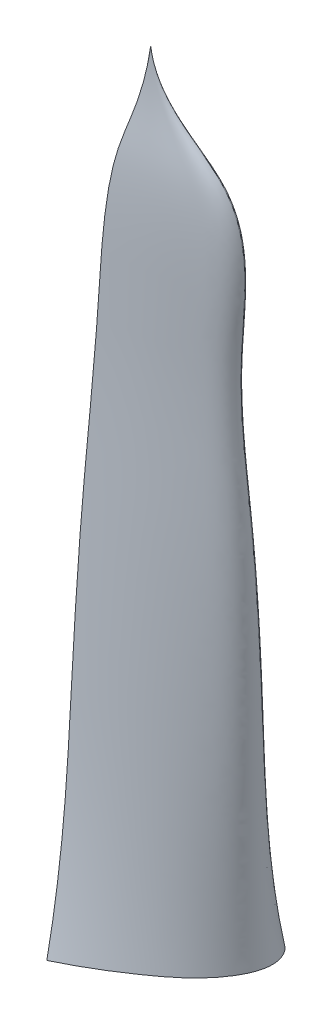
ISO-10303-21;
HEADER;
FILE_DESCRIPTION(('STEP AP214'),'2;1');
FILE_NAME('part.step','',(''),(''),'','','');
FILE_SCHEMA(('AUTOMOTIVE_DESIGN { 1 0 10303 214 1 1 1 1 }'));
ENDSEC;
DATA;
#1=APPLICATION_CONTEXT('core data for automotive mechanical design processes');
#2=APPLICATION_PROTOCOL_DEFINITION('international standard','automotive_design',2000,#1);
#3=PRODUCT_CONTEXT('',#1,'mechanical');
#4=PRODUCT('Part','Part','',(#3));
#5=PRODUCT_RELATED_PRODUCT_CATEGORY('part','',(#4));
#6=PRODUCT_DEFINITION_FORMATION('','',#4);
#7=PRODUCT_DEFINITION_CONTEXT('part definition',#1,'design');
#8=PRODUCT_DEFINITION('design','',#6,#7);
#9=PRODUCT_DEFINITION_SHAPE('','',#8);
#10=(LENGTH_UNIT() NAMED_UNIT(*) SI_UNIT(.MILLI.,.METRE.));
#11=(NAMED_UNIT(*) PLANE_ANGLE_UNIT() SI_UNIT($,.RADIAN.));
#12=(NAMED_UNIT(*) SI_UNIT($,.STERADIAN.) SOLID_ANGLE_UNIT());
#13=UNCERTAINTY_MEASURE_WITH_UNIT(LENGTH_MEASURE(1.E-05),#10,'distance_accuracy_value','');
#14=(GEOMETRIC_REPRESENTATION_CONTEXT(3) GLOBAL_UNCERTAINTY_ASSIGNED_CONTEXT((#13)) GLOBAL_UNIT_ASSIGNED_CONTEXT((#10,
#11,#12)) REPRESENTATION_CONTEXT('',''));
#15=CARTESIAN_POINT('',(0.,0.,0.));
#16=DIRECTION('',(0.,0.,1.));
#17=DIRECTION('',(1.,0.,0.));
#18=AXIS2_PLACEMENT_3D('',#15,#16,#17);
#19=CARTESIAN_POINT('',(27.3903864156705,193.04,16.7732601391821));
#20=DIRECTION('',(0.,1.,0.));
#21=DIRECTION('',(0.,0.,1.));
#22=AXIS2_PLACEMENT_3D('',#19,#20,#21);
#23=PLANE('',#22);
#24=CARTESIAN_POINT('',(-51.0502633096916,193.04,65.8880250046538));
#25=CARTESIAN_POINT('',(-29.4080359716208,193.04,55.5335888101065));
#26=CARTESIAN_POINT('',(6.39775669908416,193.04,34.1414433918272));
#27=CARTESIAN_POINT('',(49.3106608585686,193.04,-0.0869634288471449));
#28=CARTESIAN_POINT('',(69.4256113628962,193.04,-38.7953768272498));
#29=CARTESIAN_POINT('',(61.1191599391449,193.04,-58.2204172722321));
#30=CARTESIAN_POINT('',(56.582333939445,193.04,-63.1890217779224));
#31=B_SPLINE_CURVE_WITH_KNOTS('',3,(#24,#25,#26,#27,#28,#29,#30),.UNSPECIFIED.,.F.,.F.,(4,1,1,1,
4),(0.0177171020432467,0.399201612433671,0.669902249986319,0.904095271302126,1.),.UNSPECIFIED.);
#32=CARTESIAN_POINT('',(-51.0502633096916,193.04,65.8880250046538));
#33=VERTEX_POINT('',#32);
#34=CARTESIAN_POINT('',(56.5823339394449,193.04,-63.1890217779224));
#35=VERTEX_POINT('',#34);
#36=EDGE_CURVE('E204',#33,#35,#31,.T.);
#37=ORIENTED_EDGE('',*,*,#36,.F.);
#38=DIRECTION('',(-0.62278778048811,0.,0.78239081057659));
#39=VECTOR('',#38,1.);
#40=CARTESIAN_POINT('',(-51.0502633096916,193.04,65.8880250046538));
#41=LINE('',#40,#39);
#42=CARTESIAN_POINT('',(51.5604673550769,193.04,-63.0189562398136));
#43=VERTEX_POINT('',#42);
#44=EDGE_CURVE('E190',#43,#33,#41,.T.);
#45=ORIENTED_EDGE('',*,*,#44,.F.);
#46=CARTESIAN_POINT('',(54.1439218116008,193.04,-60.9625109886419));
#47=DIRECTION('',(0.,1.,0.));
#48=DIRECTION('',(0.,0.,-1.));
#49=AXIS2_PLACEMENT_3D('',#46,#47,#48);
#50=CIRCLE('',#49,3.30199999999999);
#51=EDGE_CURVE('E191',#35,#43,#50,.T.);
#52=ORIENTED_EDGE('',*,*,#51,.F.);
#53=EDGE_LOOP('',(#37,#45,#52));
#54=FACE_BOUND('',#53,.T.);
#55=ADVANCED_FACE('F162',(#54),#23,.F.);
#56=CARTESIAN_POINT('',(56.5823339394449,193.04,-63.1890217779224));
#57=CARTESIAN_POINT('',(57.6564598597152,224.95538014561,-54.9881752056704));
#58=CARTESIAN_POINT('',(60.1807349888683,305.115980336233,-40.0172295989538));
#59=CARTESIAN_POINT('',(66.0053734685914,433.937675680103,-31.1541565366904));
#60=CARTESIAN_POINT('',(65.8905401425748,580.253237547307,-22.2820204894803));
#61=CARTESIAN_POINT('',(51.8750555986007,719.661239150954,-15.3549033811939));
#62=CARTESIAN_POINT('',(82.3922586658384,870.668992981242,-14.5492681769807));
#63=CARTESIAN_POINT('',(-8.88055085515012,916.999693508035,-1.90958778796577));
#64=CARTESIAN_POINT('',(-13.7823194,965.2,0.));
#65=CARTESIAN_POINT('',(56.4638482663645,193.04,-63.3187839616972));
#66=CARTESIAN_POINT('',(57.5611742421126,224.955548362745,-55.1229280616902));
#67=CARTESIAN_POINT('',(60.1279877256092,305.115862407605,-40.1580139305224));
#68=CARTESIAN_POINT('',(65.9944598121193,433.937712998386,-31.3011336589291));
#69=CARTESIAN_POINT('',(65.9106477657984,580.253224905395,-22.4179870198765));
#70=CARTESIAN_POINT('',(51.9071782218437,719.661252454668,-15.4603857200904));
#71=CARTESIAN_POINT('',(82.4554967197115,870.668957051674,-14.6690591047114));
#72=CARTESIAN_POINT('',(-8.88005917627443,916.999749128808,-1.9207557726907));
#73=CARTESIAN_POINT('',(-13.7823194,965.2,0.));
#74=CARTESIAN_POINT('',(56.1891672771625,193.04,-63.5787000517568));
#75=CARTESIAN_POINT('',(57.3328933638662,224.955884797015,-55.3928254962396));
#76=CARTESIAN_POINT('',(59.9927303123508,305.115626550348,-40.4456095238959));
#77=CARTESIAN_POINT('',(65.9351402689739,433.937787634951,-31.5921801311704));
#78=CARTESIAN_POINT('',(65.9128826889724,580.253199621573,-22.6859669041055));
#79=CARTESIAN_POINT('',(51.9281669789958,719.661279062092,-15.6524172274836));
#80=CARTESIAN_POINT('',(82.5159249999944,870.668885192543,-14.8899596362624));
#81=CARTESIAN_POINT('',(-8.87907581852305,916.999860370353,-1.94309174214052));
#82=CARTESIAN_POINT('',(-13.7823194,965.2,0.));
#83=CARTESIAN_POINT('',(55.6306539667948,193.04,-63.9397414922138));
#84=CARTESIAN_POINT('',(56.8582727922136,224.95673087074,-55.7770098175588));
#85=CARTESIAN_POINT('',(59.6749244857976,305.115034838438,-40.861328721393));
#86=CARTESIAN_POINT('',(65.7483360880859,433.937967710507,-31.9918634622748));
#87=CARTESIAN_POINT('',(65.8116011526854,580.253163932211,-23.0570495595296));
#88=CARTESIAN_POINT('',(51.8872010906486,719.661241951824,-15.8984327595833));
#89=CARTESIAN_POINT('',(82.5103887607781,870.669050435,-15.1910231423962));
#90=CARTESIAN_POINT('',(-8.88668274564937,916.999596221878,-1.96646267979184));
#91=CARTESIAN_POINT('',(-13.7823194,965.2,0.));
#92=CARTESIAN_POINT('',(54.9005083188148,193.04,-64.2126402634231));
#93=CARTESIAN_POINT('',(56.2321380616942,224.95799215701,-56.0836334063638));
#94=CARTESIAN_POINT('',(59.2431489455097,305.114152598654,-41.2184873118182));
#95=CARTESIAN_POINT('',(65.4674632456956,433.938236926852,-32.3286989969087));
#96=CARTESIAN_POINT('',(65.6274529497712,580.253107916505,-23.3799002461271));
#97=CARTESIAN_POINT('',(51.7921266959312,719.661197114745,-16.1082493148372));
#98=CARTESIAN_POINT('',(82.4290903735151,870.669261899581,-15.4573838722488));
#99=CARTESIAN_POINT('',(-8.89742167562409,916.999257265133,-1.98580908746115));
#100=CARTESIAN_POINT('',(-13.7823194,965.2,0.));
#101=CARTESIAN_POINT('',(54.0308081842834,193.04,-64.3026441607041));
#102=CARTESIAN_POINT('',(55.484502610083,224.96063731182,-56.2345715733744));
#103=CARTESIAN_POINT('',(58.7206349931368,305.11230152654,-41.4688955227533));
#104=CARTESIAN_POINT('',(65.115883989263,433.938806056595,-32.5874970636968));
#105=CARTESIAN_POINT('',(65.3717150725977,580.252973854347,-23.6421289823099));
#106=CARTESIAN_POINT('',(51.6545643382135,719.661164936231,-16.2827020771166));
#107=CARTESIAN_POINT('',(82.2880819853897,870.669499672029,-15.6870701259289));
#108=CARTESIAN_POINT('',(-8.91140554867155,916.998869818139,-2.00113465174902));
#109=CARTESIAN_POINT('',(-13.7823194,965.2,0.));
#110=CARTESIAN_POINT('',(53.1691895578024,193.04,-64.1540091445387));
#111=CARTESIAN_POINT('',(54.7239882815451,224.96553040627,-56.1814923445432));
#112=CARTESIAN_POINT('',(58.1504890445573,305.108876468851,-41.5791697372709));
#113=CARTESIAN_POINT('',(64.7103436992304,433.939863567445,-32.7482380429167));
#114=CARTESIAN_POINT('',(65.0590618963279,580.252708603393,-23.8334923256712));
#115=CARTESIAN_POINT('',(51.4791497745836,719.661169769427,-16.4188618902051));
#116=CARTESIAN_POINT('',(82.0934690295777,870.669725472393,-15.8733795865566));
#117=CARTESIAN_POINT('',(-8.92820392892339,916.998489611829,-2.01324720602713));
#118=CARTESIAN_POINT('',(-13.7823194,965.2,0.));
#119=CARTESIAN_POINT('',(52.4591789731738,193.04,-63.8323394749903));
#120=CARTESIAN_POINT('',(54.0627907814066,224.9712052267,-55.9599075586258));
#121=CARTESIAN_POINT('',(57.5901012323702,305.104904073104,-41.5378876739306));
#122=CARTESIAN_POINT('',(64.2760187982233,433.941090813005,-32.8088286031577));
#123=CARTESIAN_POINT('',(64.7032981841885,580.252398100499,-23.9406314284259));
#124=CARTESIAN_POINT('',(51.2684384689246,719.661186096545,-16.5121183082841));
#125=CARTESIAN_POINT('',(81.850634764106,870.66995168895,-16.0093672875624));
#126=CARTESIAN_POINT('',(-8.94852215126564,916.998104723707,-2.02135777616444));
#127=CARTESIAN_POINT('',(-13.7823194,965.2,0.));
#128=CARTESIAN_POINT('',(51.9263705731792,193.04,-63.4343404191118));
#129=CARTESIAN_POINT('',(53.5406555717489,224.976066107133,-55.6434619568625));
#130=CARTESIAN_POINT('',(57.0953939482828,305.10150160146,-41.3713589594171));
#131=CARTESIAN_POINT('',(63.838352965756,433.94214116447,-32.7549937835935));
#132=CARTESIAN_POINT('',(64.3188343303388,580.252135317487,-23.9551664014298));
#133=CARTESIAN_POINT('',(51.0222949968938,719.66118820684,-16.5501071063237));
#134=CARTESIAN_POINT('',(81.5583523512899,870.670184952601,-16.0791679077899));
#135=CARTESIAN_POINT('',(-8.97249640887019,916.997712949794,-2.02545816039879));
#136=CARTESIAN_POINT('',(-13.7823194,965.2,0.));
#137=CARTESIAN_POINT('',(51.6699028453118,193.04,-63.1564369749746));
#138=CARTESIAN_POINT('',(53.2791463327736,224.978295036058,-55.4024997381768));
#139=CARTESIAN_POINT('',(56.8278613337418,305.099942068497,-41.2085452290257));
#140=CARTESIAN_POINT('',(63.5621418166873,433.94261932269,-32.6474946600604));
#141=CARTESIAN_POINT('',(64.0590067584314,580.252027534888,-23.8917552425177));
#142=CARTESIAN_POINT('',(50.831230572998,719.661141758879,-16.5251316684913));
#143=CARTESIAN_POINT('',(81.3290291852116,870.670449606891,-16.069477064001));
#144=CARTESIAN_POINT('',(-8.99295754271348,916.997285384362,-2.0199725892584));
#145=CARTESIAN_POINT('',(-13.7823194,965.2,0.));
#146=CARTESIAN_POINT('',(42.9320954690671,193.04,-52.1793747879095));
#147=CARTESIAN_POINT('',(44.3391284703665,225.066863264398,-45.897507455777));
#148=CARTESIAN_POINT('',(47.3300395583481,305.037973039536,-34.0217617863481));
#149=CARTESIAN_POINT('',(53.3296959831195,433.961618090045,-27.0724261209034));
#150=CARTESIAN_POINT('',(53.9096080326386,580.247749182188,-19.7899384487152));
#151=CARTESIAN_POINT('',(42.5418127447663,719.659279433144,-13.7396221624817));
#152=CARTESIAN_POINT('',(70.9162320736962,870.681021323991,-13.2556191513442));
#153=CARTESIAN_POINT('',(-9.81059058133363,916.980208526185,-1.79831394180666));
#154=CARTESIAN_POINT('',(-13.7823194,965.2,0.));
#155=CARTESIAN_POINT('',(25.7931119453523,193.04,-30.6481507791976));
#156=CARTESIAN_POINT('',(26.6540509985509,225.177085265039,-26.8524291397478));
#157=CARTESIAN_POINT('',(28.7334041992243,304.960889218507,-20.1395100158756));
#158=CARTESIAN_POINT('',(33.0891250906794,433.985070596844,-15.9700069835312));
#159=CARTESIAN_POINT('',(33.8486393262921,580.243124581767,-11.7191965984292));
#160=CARTESIAN_POINT('',(26.0715876144003,719.654352345821,-8.12721519566173));
#161=CARTESIAN_POINT('',(50.3244190612465,870.702856059784,-7.93520187335008));
#162=CARTESIAN_POINT('',(-11.5468189752715,916.945312711716,-0.945933998451135));
#163=CARTESIAN_POINT('',(-13.7823194,965.2,0.));
#164=CARTESIAN_POINT('',(0.25510202269265,193.04,1.43453438242004));
#165=CARTESIAN_POINT('',(0.372830159534729,225.234181986523,1.21141081497311));
#166=CARTESIAN_POINT('',(0.872015869825522,304.920940193471,0.862786304143008));
#167=CARTESIAN_POINT('',(2.74818768396476,433.997317567791,0.608726424922191));
#168=CARTESIAN_POINT('',(3.70222561660654,580.240369574175,0.443525964014228));
#169=CARTESIAN_POINT('',(1.26872589166292,719.653140245102,0.264338842013009));
#170=CARTESIAN_POINT('',(19.2288338901228,870.709709597679,0.293360088173849));
#171=CARTESIAN_POINT('',(-14.0783497515129,916.934243610955,0.0127774771608116));
#172=CARTESIAN_POINT('',(-13.7823194,965.2,0.));
#173=CARTESIAN_POINT('',(-25.2829078999671,193.04,33.5172195440378));
#174=CARTESIAN_POINT('',(-25.9406201125143,225.17075109164,29.3666451358804));
#175=CARTESIAN_POINT('',(-26.9667388481337,304.965308380201,21.8008570419822));
#176=CARTESIAN_POINT('',(-27.6001087395354,433.983779665615,17.2085549137118));
#177=CARTESIAN_POINT('',(-26.441000940373,580.243182393655,12.5963805665918));
#178=CARTESIAN_POINT('',(-23.5395376355273,719.655410965347,8.67430621416367));
#179=CARTESIAN_POINT('',(-11.8503793823063,870.699022245278,8.46520166904806));
#180=CARTESIAN_POINT('',(-16.6354539098846,916.951372758912,1.06019224077672));
#181=CARTESIAN_POINT('',(-13.7823194,965.2,0.));
#182=CARTESIAN_POINT('',(-42.4218914236818,193.04,55.0484435527497));
#183=CARTESIAN_POINT('',(-43.5649709896749,225.024372175514,48.2342641612558));
#184=CARTESIAN_POINT('',(-45.6060334538895,305.067700720619,35.8078300370235));
#185=CARTESIAN_POINT('',(-47.8267440443157,433.952515590133,28.2699327633613));
#186=CARTESIAN_POINT('',(-46.5082301331314,580.249756871225,20.6865802004631));
#187=CARTESIAN_POINT('',(-39.9986328014514,719.660340233156,14.249851618118));
#188=CARTESIAN_POINT('',(-32.4762060622446,870.675392957001,13.8994392006098));
#189=CARTESIAN_POINT('',(-18.3185198573651,916.98927619947,1.73454152372721));
#190=CARTESIAN_POINT('',(-13.7823194,965.2,0.));
#191=CARTESIAN_POINT('',(-51.0502633096916,193.04,65.8880250046538));
#192=CARTESIAN_POINT('',(-52.4360265524076,224.951182717451,57.7420431214916));
#193=CARTESIAN_POINT('',(-54.9546995556923,305.118896890827,42.8189893581689));
#194=CARTESIAN_POINT('',(-57.9408548118796,433.936883552392,33.8032979906147));
#195=CARTESIAN_POINT('',(-56.5262604400088,580.253044110011,24.7238676397412));
#196=CARTESIAN_POINT('',(-48.1914419801335,719.662804867061,17.0250290783229));
#197=CARTESIAN_POINT('',(-42.7367332070179,870.663578312863,16.6024148419311));
#198=CARTESIAN_POINT('',(-19.1600528311054,917.008227919749,2.07171616520247));
#199=CARTESIAN_POINT('',(-13.7823194,965.2,0.));
#200=B_SPLINE_SURFACE_WITH_KNOTS('',3,3,((#56,#57,#58,#59,#60,#61,#62,#63,#64),(#65,#66,#67,#68,
#69,#70,#71,#72,#73),(#74,#75,#76,#77,#78,#79,#80,#81,#82),(#83,#84,#85,#86,#87,#88,#89,#90,
#91),(#92,#93,#94,#95,#96,#97,#98,#99,#100),(#101,#102,#103,#104,#105,#106,#107,#108,#109),
(#110,#111,#112,#113,#114,#115,#116,#117,#118),(#119,#120,#121,#122,#123,#124,#125,#126,#127),
(#128,#129,#130,#131,#132,#133,#134,#135,#136),(#137,#138,#139,#140,#141,#142,#143,#144,#145),
(#146,#147,#148,#149,#150,#151,#152,#153,#154),(#155,#156,#157,#158,#159,#160,#161,#162,#163),
(#164,#165,#166,#167,#168,#169,#170,#171,#172),(#173,#174,#175,#176,#177,#178,#179,#180,#181),
(#182,#183,#184,#185,#186,#187,#188,#189,#190),(#191,#192,#193,#194,#195,#196,#197,#198,#199)),
.UNSPECIFIED.,.F.,.F.,.F.,(4,1,1,1,1,1,1,1,2,1,1,1,4),(4,1,1,1,1,1,4),(0.,0.00309236144927212,
0.00618472289854423,0.00927708434781635,0.0123694457970885,0.0154618072463606,
0.0185541686956327,0.0216465301449048,0.0247388915941769,0.268554168695633,0.512369445797089,
0.756184722898544,1.),(0.,0.124548530138903,0.309490406468245,0.494076749431365,
0.678611934991461,0.863457448769692,1.),.UNSPECIFIED.);
#201=CARTESIAN_POINT('',(-51.0502633096916,193.04,65.8880250046538));
#202=CARTESIAN_POINT('',(-52.4360265524076,224.951182717451,57.7420431214916));
#203=CARTESIAN_POINT('',(-54.9546995556923,305.118896890827,42.8189893581689));
#204=CARTESIAN_POINT('',(-57.9408548118796,433.936883552392,33.8032979906147));
#205=CARTESIAN_POINT('',(-56.5262604400088,580.253044110011,24.7238676397412));
#206=CARTESIAN_POINT('',(-48.1914419801335,719.662804867061,17.0250290783229));
#207=CARTESIAN_POINT('',(-42.7367332070179,870.663578312863,16.6024148419311));
#208=CARTESIAN_POINT('',(-19.1600528311054,917.008227919749,2.07171616520247));
#209=CARTESIAN_POINT('',(-13.7823194,965.2,0.));
#210=B_SPLINE_CURVE_WITH_KNOTS('',3,(#201,#202,#203,#204,#205,#206,#207,#208,#209),
.UNSPECIFIED.,.F.,.F.,(4,1,1,1,1,1,4),(0.,0.124548530138903,0.309490406468245,0.494076749431365,
0.678611934991461,0.863457448769692,1.),.UNSPECIFIED.);
#211=CARTESIAN_POINT('',(-13.7823194,965.2,0.));
#212=VERTEX_POINT('',#211);
#213=EDGE_CURVE('E12',#33,#212,#210,.T.);
#214=CARTESIAN_POINT('',(56.5823339394449,193.04,-63.1890217779224));
#215=CARTESIAN_POINT('',(57.6564598597152,224.95538014561,-54.9881752056704));
#216=CARTESIAN_POINT('',(60.1807349888683,305.115980336233,-40.0172295989538));
#217=CARTESIAN_POINT('',(66.0053734685914,433.937675680103,-31.1541565366904));
#218=CARTESIAN_POINT('',(65.8905401425748,580.253237547307,-22.2820204894803));
#219=CARTESIAN_POINT('',(51.8750555986007,719.661239150954,-15.3549033811939));
#220=CARTESIAN_POINT('',(82.3922586658384,870.668992981242,-14.5492681769807));
#221=CARTESIAN_POINT('',(-8.88055085515012,916.999693508035,-1.90958778796577));
#222=CARTESIAN_POINT('',(-13.7823194,965.2,0.));
#223=B_SPLINE_CURVE_WITH_KNOTS('',3,(#214,#215,#216,#217,#218,#219,#220,#221,#222),
.UNSPECIFIED.,.F.,.F.,(4,1,1,1,1,1,4),(0.,0.124548530138903,0.309490406468245,0.494076749431365,
0.678611934991461,0.863457448769692,1.),.UNSPECIFIED.);
#224=EDGE_CURVE('E180',#212,#35,#223,.F.);
#225=ORIENTED_EDGE('',*,*,#51,.T.);
#226=ORIENTED_EDGE('',*,*,#44,.T.);
#227=ORIENTED_EDGE('',*,*,#213,.T.);
#228=ORIENTED_EDGE('',*,*,#224,.T.);
#229=EDGE_LOOP('',(#225,#226,#227,#228));
#230=FACE_BOUND('',#229,.T.);
#231=ADVANCED_FACE('F198',(#230),#200,.T.);
#232=CARTESIAN_POINT('',(-51.0502633096916,193.04,65.8880250046538));
#233=CARTESIAN_POINT('',(-52.4360265524076,224.951182717451,57.7420431214916));
#234=CARTESIAN_POINT('',(-54.9546995556922,305.118896890827,42.8189893581689));
#235=CARTESIAN_POINT('',(-57.9408548118797,433.936883552392,33.8032979906147));
#236=CARTESIAN_POINT('',(-56.5262604400087,580.253044110011,24.7238676397412));
#237=CARTESIAN_POINT('',(-48.1914419801336,719.662804867061,17.025029078323));
#238=CARTESIAN_POINT('',(-42.7367332070179,870.663578312863,16.6024148419311));
#239=CARTESIAN_POINT('',(-19.1600528311054,917.008227919749,2.07171616520247));
#240=CARTESIAN_POINT('',(-13.7823194,965.2,0.));
#241=CARTESIAN_POINT('',(-47.5673581705481,193.04,64.2216753045246));
#242=CARTESIAN_POINT('',(-49.1322467037644,224.96625935834,56.3611727602752));
#243=CARTESIAN_POINT('',(-51.9687499258371,305.108355389713,41.939836612205));
#244=CARTESIAN_POINT('',(-54.9717340456563,433.940078909386,33.1870486987837));
#245=CARTESIAN_POINT('',(-53.746985577768,580.252457567976,24.3383081306862));
#246=CARTESIAN_POINT('',(-45.9746823860201,719.66195926569,16.7469137786539));
#247=CARTESIAN_POINT('',(-40.0193457440061,870.667135837748,16.401045331748));
#248=CARTESIAN_POINT('',(-18.9300504659845,917.002557205569,2.03071147717753));
#249=CARTESIAN_POINT('',(-13.7823194,965.2,0.));
#250=CARTESIAN_POINT('',(-40.6405279131622,193.04,60.7788011105703));
#251=CARTESIAN_POINT('',(-42.5636670273791,224.99641264012,53.4892572441465));
#252=CARTESIAN_POINT('',(-45.9753069754487,305.087272387486,40.1204910338336));
#253=CARTESIAN_POINT('',(-49.0223562113752,433.946469623374,31.8949278735432));
#254=CARTESIAN_POINT('',(-48.1659219973981,580.251284483905,23.5381798257161));
#255=CARTESIAN_POINT('',(-41.5249182179573,719.660268062947,16.1809598841959));
#256=CARTESIAN_POINT('',(-34.5665423648899,870.674250887517,15.9760885880393));
#257=CARTESIAN_POINT('',(-18.4700457357425,916.991215777209,1.94870210112763));
#258=CARTESIAN_POINT('',(-13.7823194,965.2,0.));
#259=CARTESIAN_POINT('',(-30.3758996755762,193.04,55.2995993257625));
#260=CARTESIAN_POINT('',(-32.7798228724197,225.035643202524,48.9183315163558));
#261=CARTESIAN_POINT('',(-37.0054482515841,305.059840747116,37.1770772721498));
#262=CARTESIAN_POINT('',(-40.0827387236349,433.954794087756,29.7872701602416));
#263=CARTESIAN_POINT('',(-39.7631103621354,580.249722015046,22.2324284280528));
#264=CARTESIAN_POINT('',(-34.8211474981061,719.658202894031,15.2860113981513));
#265=CARTESIAN_POINT('',(-26.3622063980968,870.683058361834,15.2534633820863));
#266=CARTESIAN_POINT('',(-17.7728184211834,916.977166800926,1.82831822452052));
#267=CARTESIAN_POINT('',(-13.7823194,965.2,0.));
#268=CARTESIAN_POINT('',(-20.2455656722735,193.04,49.5211409342901));
#269=CARTESIAN_POINT('',(-23.1029219623088,225.069579696508,44.0837518047564));
#270=CARTESIAN_POINT('',(-28.0806645927141,305.036110177789,34.0384738842302));
#271=CARTESIAN_POINT('',(-31.1661130393954,433.96199925165,27.5049879283649));
#272=CARTESIAN_POINT('',(-31.3615843854349,580.248355519026,20.8068167911155));
#273=CARTESIAN_POINT('',(-28.1138281105574,719.656471897985,14.3248194367118));
#274=CARTESIAN_POINT('',(-18.1547727541397,870.690492765149,14.4315226562754));
#275=CARTESIAN_POINT('',(-17.0745901331619,916.965303802789,1.70508014682417));
#276=CARTESIAN_POINT('',(-13.7823194,965.2,0.));
#277=CARTESIAN_POINT('',(-10.2838225551071,193.04,43.4742945718059));
#278=CARTESIAN_POINT('',(-13.5599767218171,225.096895427226,39.0087734587051));
#279=CARTESIAN_POINT('',(-19.2333888339023,305.017009111274,30.7021626757211));
#280=CARTESIAN_POINT('',(-22.3053017620876,433.967799587758,25.04750602029));
#281=CARTESIAN_POINT('',(-22.9914039555512,580.247252515626,19.2458281036838));
#282=CARTESIAN_POINT('',(-21.4243779687969,719.655090169947,13.2791471408355));
#283=CARTESIAN_POINT('',(-9.96543455012904,870.696438313874,13.4963235677181));
#284=CARTESIAN_POINT('',(-16.3775814137894,916.955815649636,1.57580740275998));
#285=CARTESIAN_POINT('',(-13.7823194,965.2,0.));
#286=CARTESIAN_POINT('',(-0.524966975930121,193.04,37.1899288739627));
#287=CARTESIAN_POINT('',(-4.18396884577288,225.11726470603,33.7147419325497));
#288=CARTESIAN_POINT('',(-10.4919598473152,305.002765848692,27.1763971153149));
#289=CARTESIAN_POINT('',(-13.5405366914814,433.972122965721,22.4150028541995));
#290=CARTESIAN_POINT('',(-14.6883714134685,580.24643703342,17.5335041069943));
#291=CARTESIAN_POINT('',(-14.7798811196788,719.65403362177,12.128670155583));
#292=CARTESIAN_POINT('',(-1.82039661958329,870.700959019857,12.4313930466295));
#293=CARTESIAN_POINT('',(-15.6856690243345,916.948603381831,1.43652459314692));
#294=CARTESIAN_POINT('',(-13.7823194,965.2,0.));
#295=CARTESIAN_POINT('',(7.45675047700221,193.04,31.7513477484486));
#296=CARTESIAN_POINT('',(3.48586819812793,225.127685278126,29.1205043960227));
#297=CARTESIAN_POINT('',(-3.33494090409641,304.995480457504,24.0843703381967));
#298=CARTESIAN_POINT('',(-6.33546238029445,433.974328238075,20.0698876831773));
#299=CARTESIAN_POINT('',(-7.84641430677482,580.246043609747,15.9691216851083));
#300=CARTESIAN_POINT('',(-9.29439780332706,719.653404495552,11.0683391341457));
#301=CARTESIAN_POINT('',(4.91610390406972,870.703566444485,11.4261514747229));
#302=CARTESIAN_POINT('',(-15.1152285538404,916.944450376312,1.30930874041059));
#303=CARTESIAN_POINT('',(-13.7823194,965.2,0.));
#304=CARTESIAN_POINT('',(13.7263634884196,193.04,27.3034169274427));
#305=CARTESIAN_POINT('',(9.51565886525227,225.131952022246,25.3544154717887));
#306=CARTESIAN_POINT('',(2.30094002543741,304.992498873024,21.5280893684388));
#307=CARTESIAN_POINT('',(-0.657925905222852,433.975223469416,18.1057405780532));
#308=CARTESIAN_POINT('',(-2.44371989427421,580.245910795206,14.626185465276));
#309=CARTESIAN_POINT('',(-4.95564996356444,719.653041459702,10.1471432994426));
#310=CARTESIAN_POINT('',(10.257253357747,870.704984724111,10.5407609302765));
#311=CARTESIAN_POINT('',(-14.6652175544579,916.942198615288,1.19861021909567));
#312=CARTESIAN_POINT('',(-13.7823194,965.2,0.));
#313=CARTESIAN_POINT('',(19.9143810528754,193.04,22.7704504284799));
#314=CARTESIAN_POINT('',(15.4722859077095,225.133567336045,21.5083155497894));
#315=CARTESIAN_POINT('',(7.87862096399913,304.991371921539,18.9004494048122));
#316=CARTESIAN_POINT('',(4.97128829222079,433.975552654645,16.0777237692685));
#317=CARTESIAN_POINT('',(2.92031217776659,580.245896134709,13.2213665169847));
#318=CARTESIAN_POINT('',(-0.644281311652265,719.652771187636,9.17789221523887));
#319=CARTESIAN_POINT('',(15.5723406455198,870.705963429567,9.60397621759839));
#320=CARTESIAN_POINT('',(-14.2187510593553,916.940651600463,1.08189164771455));
#321=CARTESIAN_POINT('',(-13.7823194,965.2,0.));
#322=CARTESIAN_POINT('',(27.4555762657405,193.04,16.873158709237));
#323=CARTESIAN_POINT('',(22.7610357041096,225.131440594894,16.4983317744641));
#324=CARTESIAN_POINT('',(14.7553311244211,304.992862672631,15.4626143935246));
#325=CARTESIAN_POINT('',(11.9314345329151,433.975081917903,13.409851715964));
#326=CARTESIAN_POINT('',(9.56984632107781,580.246052040919,11.3484837234117));
#327=CARTESIAN_POINT('',(4.70406346656337,719.652617621615,7.87703578278186));
#328=CARTESIAN_POINT('',(22.1785823831447,870.706369023331,8.34181681393363));
#329=CARTESIAN_POINT('',(-13.6660362643044,916.940024894641,0.9245730468468));
#330=CARTESIAN_POINT('',(-13.7823194,965.2,0.));
#331=CARTESIAN_POINT('',(36.1101485643294,193.04,9.19990874085538));
#332=CARTESIAN_POINT('',(31.2291763311166,225.123455642731,9.96230789500218));
#333=CARTESIAN_POINT('',(22.9235478862963,304.998449950774,10.9508366882375));
#334=CARTESIAN_POINT('',(20.2665714886831,433.973366921056,9.94672996780957));
#335=CARTESIAN_POINT('',(17.5589140632731,580.246445609881,8.90812598264803));
#336=CARTESIAN_POINT('',(11.1378259543652,719.652756247803,6.19879856199899));
#337=CARTESIAN_POINT('',(30.1301353411438,870.705513276716,6.72813126898911));
#338=CARTESIAN_POINT('',(-13.0008848195107,916.941411413787,0.720131805506001));
#339=CARTESIAN_POINT('',(-13.7823194,965.2,0.));
#340=CARTESIAN_POINT('',(42.8856058050626,193.04,2.14971559036847));
#341=CARTESIAN_POINT('',(37.9998375804006,225.112784299169,3.94407515014599));
#342=CARTESIAN_POINT('',(29.6962949479866,305.005913971072,6.78241484735974));
#343=CARTESIAN_POINT('',(27.258355727072,433.971090933649,6.79963598684366));
#344=CARTESIAN_POINT('',(24.3067245234084,580.246913075273,6.71678562816442));
#345=CARTESIAN_POINT('',(16.567883870166,719.653159711531,4.71274994640242));
#346=CARTESIAN_POINT('',(36.8358357452243,870.703643953281,5.32816166591828));
#347=CARTESIAN_POINT('',(-12.4378055998841,916.944405289753,0.53714763273593));
#348=CARTESIAN_POINT('',(-13.7823194,965.2,0.));
#349=CARTESIAN_POINT('',(48.017788882997,193.04,-4.01631616115597));
#350=CARTESIAN_POINT('',(43.2423222137211,225.100669015506,-1.32459008776761));
#351=CARTESIAN_POINT('',(35.1305124359242,305.014387495551,3.1335003901544));
#352=CARTESIAN_POINT('',(32.9356963548379,433.968509399206,4.10495208701691));
#353=CARTESIAN_POINT('',(29.7947326245808,580.24743494836,4.86079845555833));
#354=CARTESIAN_POINT('',(20.9902379709135,719.65365075208,3.48660911419512));
#355=CARTESIAN_POINT('',(42.2847997153183,870.701411994582,4.19854367797543));
#356=CARTESIAN_POINT('',(-11.9772311154933,916.947976729734,0.385099869237595));
#357=CARTESIAN_POINT('',(-13.7823194,965.2,0.));
#358=CARTESIAN_POINT('',(51.6988804029356,193.04,-8.91802074871566));
#359=CARTESIAN_POINT('',(47.0753482466094,225.089444177659,-5.51598522930575));
#360=CARTESIAN_POINT('',(39.2221636228558,305.02223833541,0.230410961606025));
#361=CARTESIAN_POINT('',(37.238161420034,433.966117067016,1.98591654177238));
#362=CARTESIAN_POINT('',(33.9750776902563,580.247920421606,3.42185158732571));
#363=CARTESIAN_POINT('',(24.3528420555528,719.654098405748,2.54554907094081));
#364=CARTESIAN_POINT('',(46.421641568829,870.699368346206,3.34680231730506));
#365=CARTESIAN_POINT('',(-11.6258639436959,916.951247526003,0.267589997775534));
#366=CARTESIAN_POINT('',(-13.7823194,965.2,0.));
#367=CARTESIAN_POINT('',(55.1416203179408,193.04,-14.0808509877416));
#368=CARTESIAN_POINT('',(50.7563086104511,225.076347437477,-9.94934663830459));
#369=CARTESIAN_POINT('',(43.3086843165551,305.031398198823,-2.86598831999061));
#370=CARTESIAN_POINT('',(41.5971923353626,433.963326933881,-0.234257787778872));
#371=CARTESIAN_POINT('',(38.2345708615203,580.248482628803,1.93533131913946));
#372=CARTESIAN_POINT('',(27.7769830139081,719.654636469959,1.59431619307833));
#373=CARTESIAN_POINT('',(50.6259899742111,870.696931483353,2.50618408570671));
#374=CARTESIAN_POINT('',(-11.2664920960793,916.955146166936,0.147963716755189));
#375=CARTESIAN_POINT('',(-13.7823194,965.2,0.));
#376=CARTESIAN_POINT('',(58.2188350603,193.04,-19.4396549887536));
#377=CARTESIAN_POINT('',(54.1502591776344,225.061323582121,-14.5826679116063));
#378=CARTESIAN_POINT('',(47.249793530061,305.041905801442,-6.15691028007588));
#379=CARTESIAN_POINT('',(45.9137272680268,433.960126704684,-2.59708759057668));
#380=CARTESIAN_POINT('',(42.4859290794552,580.249125889029,0.348852237805855));
#381=CARTESIAN_POINT('',(31.2216688407481,719.655259945274,0.59329578770574));
#382=CARTESIAN_POINT('',(54.8600594158808,870.694115303745,1.63358316052634));
#383=CARTESIAN_POINT('',(-10.9039508617485,916.959651087366,0.0211414637858041));
#384=CARTESIAN_POINT('',(-13.7823194,965.2,0.));
#385=CARTESIAN_POINT('',(60.8301806019774,193.04,-24.9506108671903));
#386=CARTESIAN_POINT('',(57.1574014186331,225.044640764107,-19.3890873714695));
#387=CARTESIAN_POINT('',(50.9471785590074,305.053573741161,-9.64665134818404));
#388=CARTESIAN_POINT('',(50.073903919594,433.95657273901,-5.14404396878288));
#389=CARTESIAN_POINT('',(46.6522477713059,580.249841500697,-1.38670273336432));
#390=CARTESIAN_POINT('',(34.6191609615099,719.655947338189,-0.510252765005442));
#391=CARTESIAN_POINT('',(59.0607087284571,870.691004544606,0.660242572478335));
#392=CARTESIAN_POINT('',(-10.5475183765176,916.964627684353,-0.118572700542862));
#393=CARTESIAN_POINT('',(-13.7823194,965.2,0.));
#394=CARTESIAN_POINT('',(63.5361379698431,193.04,-32.4311600056839));
#395=CARTESIAN_POINT('',(60.4919958881111,225.02102307355,-25.9856751138258));
#396=CARTESIAN_POINT('',(55.3926746645774,305.070091769294,-14.5788708095711));
#397=CARTESIAN_POINT('',(55.278607249037,433.951542237282,-8.82999512531936));
#398=CARTESIAN_POINT('',(51.9748259282501,580.25085161957,-3.97387239786397));
#399=CARTESIAN_POINT('',(39.0068557610031,719.656931530138,-2.18519616559397));
#400=CARTESIAN_POINT('',(64.5376478762989,870.686563902648,-0.860311042750982));
#401=CARTESIAN_POINT('',(-10.0896491799432,916.971730813769,-0.328712812916711));
#402=CARTESIAN_POINT('',(-13.7823194,965.2,0.));
#403=CARTESIAN_POINT('',(65.2011638850808,193.04,-41.8983722002678));
#404=CARTESIAN_POINT('',(63.1280319679318,224.991140206221,-34.5090044231274));
#405=CARTESIAN_POINT('',(59.7632314788851,305.090990712354,-21.2554372145703));
#406=CARTESIAN_POINT('',(60.8856169520292,433.945182078099,-14.0767446169673));
#407=CARTESIAN_POINT('',(57.9708309245076,580.252112103614,-7.85579215941202));
#408=CARTESIAN_POINT('',(44.0739281060023,719.65824241253,-4.78763017160084));
#409=CARTESIAN_POINT('',(71.0075911513566,870.680727070782,-3.34134351427193));
#410=CARTESIAN_POINT('',(-9.57481411319106,916.981061271403,-0.653332551672012));
#411=CARTESIAN_POINT('',(-13.7823194,965.2,0.));
#412=CARTESIAN_POINT('',(63.557190915355,193.04,-53.0866168297213));
#413=CARTESIAN_POINT('',(62.9183949829672,224.961524498046,-44.9112805414309));
#414=CARTESIAN_POINT('',(62.224098849045,305.111698844052,-30.2230441400147));
#415=CARTESIAN_POINT('',(65.3440371736365,433.938899971904,-21.70135093774));
#416=CARTESIAN_POINT('',(63.4291595101165,580.253283765093,-13.9754438507622));
#417=CARTESIAN_POINT('',(48.9927590693806,719.659830779963,-9.11354260523082));
#418=CARTESIAN_POINT('',(77.6580861994112,870.673980598862,-7.77065533395689));
#419=CARTESIAN_POINT('',(-9.0832788977935,916.991820462633,-1.16559224532273));
#420=CARTESIAN_POINT('',(-13.7823194,965.2,0.));
#421=CARTESIAN_POINT('',(59.4865485249881,193.04,-60.0084074726403));
#422=CARTESIAN_POINT('',(59.9897004943723,224.957428263088,-51.8160643283755));
#423=CARTESIAN_POINT('',(61.3646672220773,305.114553172173,-36.670545170827));
#424=CARTESIAN_POINT('',(66.2485534507387,433.938083777371,-27.8780213868304));
#425=CARTESIAN_POINT('',(65.4496932882258,580.253252953235,-19.3123691240888));
#426=CARTESIAN_POINT('',(51.1724231236157,719.660769693958,-13.0940240790261));
#427=CARTESIAN_POINT('',(81.098249398364,870.670655520449,-12.038556089258));
#428=CARTESIAN_POINT('',(-8.94812686936458,916.997069159568,-1.66158927375142));
#429=CARTESIAN_POINT('',(-13.7823194,965.2,0.));
#430=CARTESIAN_POINT('',(56.582333939445,193.04,-63.1890217779224));
#431=CARTESIAN_POINT('',(57.6564598597152,224.95538014561,-54.9881752056704));
#432=CARTESIAN_POINT('',(60.1807349888683,305.115980336233,-40.0172295989538));
#433=CARTESIAN_POINT('',(66.0053734685914,433.937675680103,-31.1541565366904));
#434=CARTESIAN_POINT('',(65.8905401425748,580.253237547307,-22.2820204894803));
#435=CARTESIAN_POINT('',(51.8750555986007,719.661239150954,-15.3549033811939));
#436=CARTESIAN_POINT('',(82.3922586658384,870.668992981242,-14.5492681769807));
#437=CARTESIAN_POINT('',(-8.88055085515012,916.999693508035,-1.90958778796577));
#438=CARTESIAN_POINT('',(-13.7823194,965.2,0.));
#439=B_SPLINE_SURFACE_WITH_KNOTS('',3,3,((#232,#233,#234,#235,#236,#237,#238,#239,#240),(#241,
#242,#243,#244,#245,#246,#247,#248,#249),(#250,#251,#252,#253,#254,#255,#256,#257,#258),(#259,
#260,#261,#262,#263,#264,#265,#266,#267),(#268,#269,#270,#271,#272,#273,#274,#275,#276),(#277,
#278,#279,#280,#281,#282,#283,#284,#285),(#286,#287,#288,#289,#290,#291,#292,#293,#294),(#295,
#296,#297,#298,#299,#300,#301,#302,#303),(#304,#305,#306,#307,#308,#309,#310,#311,#312),(#313,
#314,#315,#316,#317,#318,#319,#320,#321),(#322,#323,#324,#325,#326,#327,#328,#329,#330),(#331,
#332,#333,#334,#335,#336,#337,#338,#339),(#340,#341,#342,#343,#344,#345,#346,#347,#348),(#349,
#350,#351,#352,#353,#354,#355,#356,#357),(#358,#359,#360,#361,#362,#363,#364,#365,#366),(#367,
#368,#369,#370,#371,#372,#373,#374,#375),(#376,#377,#378,#379,#380,#381,#382,#383,#384),(#385,
#386,#387,#388,#389,#390,#391,#392,#393),(#394,#395,#396,#397,#398,#399,#400,#401,#402),(#403,
#404,#405,#406,#407,#408,#409,#410,#411),(#412,#413,#414,#415,#416,#417,#418,#419,#420),(#421,
#422,#423,#424,#425,#426,#427,#428,#429),(#430,#431,#432,#433,#434,#435,#436,#437,#438)),
.UNSPECIFIED.,.F.,.F.,.F.,(4,1,1,1,1,1,1,1,1,1,1,1,1,1,1,1,1,1,1,1,4),(4,1,1,1,1,1,4),(0.,
0.0625,0.125,0.1875,0.25,0.3125,0.375,0.40625,0.4375,0.5,0.5625,0.625,0.65625,0.6875,0.71875,
0.75,0.78125,0.8125,0.875,0.9375,1.),(0.,0.124548530138903,0.309490406468245,0.494076749431365,
0.678611934991461,0.863457448769692,1.),.UNSPECIFIED.);
#440=ORIENTED_EDGE('',*,*,#36,.T.);
#441=ORIENTED_EDGE('',*,*,#224,.F.);
#442=ORIENTED_EDGE('',*,*,#213,.F.);
#443=EDGE_LOOP('',(#440,#441,#442));
#444=FACE_BOUND('',#443,.T.);
#445=ADVANCED_FACE('F164',(#444),#439,.T.);
#446=CLOSED_SHELL('',(#55,#231,#445));
#447=MANIFOLD_SOLID_BREP('B2',#446);
#448=ADVANCED_BREP_SHAPE_REPRESENTATION('',(#18,#447),#14);
#449=SHAPE_DEFINITION_REPRESENTATION(#9,#448);
ENDSEC;
END-ISO-10303-21;
